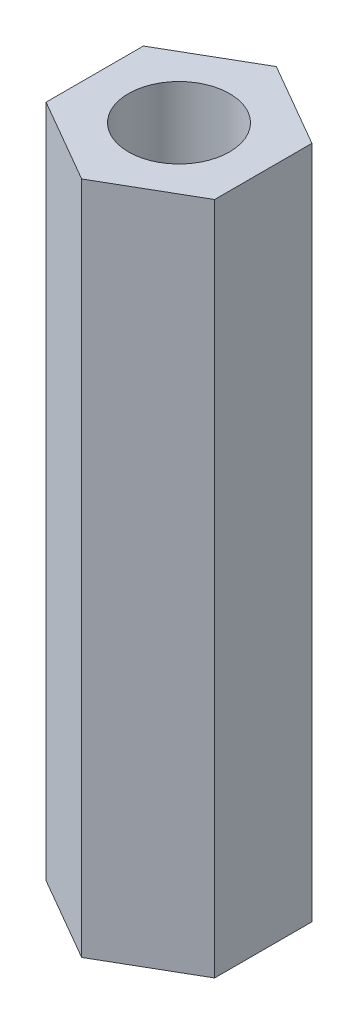
ISO-10303-21;
HEADER;
FILE_DESCRIPTION(('STEP AP214'),'2;1');
FILE_NAME('part.step','',(''),(''),'','','');
FILE_SCHEMA(('AUTOMOTIVE_DESIGN { 1 0 10303 214 1 1 1 1 }'));
ENDSEC;
DATA;
#1=APPLICATION_CONTEXT('core data for automotive mechanical design processes');
#2=APPLICATION_PROTOCOL_DEFINITION('international standard','automotive_design',2000,#1);
#3=PRODUCT_CONTEXT('',#1,'mechanical');
#4=PRODUCT('Part','Part','',(#3));
#5=PRODUCT_RELATED_PRODUCT_CATEGORY('part','',(#4));
#6=PRODUCT_DEFINITION_FORMATION('','',#4);
#7=PRODUCT_DEFINITION_CONTEXT('part definition',#1,'design');
#8=PRODUCT_DEFINITION('design','',#6,#7);
#9=PRODUCT_DEFINITION_SHAPE('','',#8);
#10=(LENGTH_UNIT() NAMED_UNIT(*) SI_UNIT(.MILLI.,.METRE.));
#11=(NAMED_UNIT(*) PLANE_ANGLE_UNIT() SI_UNIT($,.RADIAN.));
#12=(NAMED_UNIT(*) SI_UNIT($,.STERADIAN.) SOLID_ANGLE_UNIT());
#13=UNCERTAINTY_MEASURE_WITH_UNIT(LENGTH_MEASURE(1.E-05),#10,'distance_accuracy_value','');
#14=(GEOMETRIC_REPRESENTATION_CONTEXT(3) GLOBAL_UNCERTAINTY_ASSIGNED_CONTEXT((#13)) GLOBAL_UNIT_ASSIGNED_CONTEXT((#10,
#11,#12)) REPRESENTATION_CONTEXT('',''));
#15=CARTESIAN_POINT('',(0.,0.,0.));
#16=DIRECTION('',(0.,0.,1.));
#17=DIRECTION('',(1.,0.,0.));
#18=AXIS2_PLACEMENT_3D('',#15,#16,#17);
#19=CARTESIAN_POINT('',(0.,20.,0.));
#20=DIRECTION('',(0.,1.,0.));
#21=DIRECTION('',(0.,0.,1.));
#22=AXIS2_PLACEMENT_3D('',#19,#20,#21);
#23=PLANE('',#22);
#24=DIRECTION('',(0.866025403784439,0.,0.5));
#25=VECTOR('',#24,1.);
#26=CARTESIAN_POINT('',(-2.5,20.,1.44337567297406));
#27=LINE('',#26,#25);
#28=CARTESIAN_POINT('',(-2.5,20.,1.44337567297406));
#29=VERTEX_POINT('',#28);
#30=CARTESIAN_POINT('',(0.,20.,2.88675134594813));
#31=VERTEX_POINT('',#30);
#32=EDGE_CURVE('E133',#29,#31,#27,.T.);
#33=ORIENTED_EDGE('',*,*,#32,.T.);
#34=DIRECTION('',(0.866025403784438,0.,-0.5));
#35=VECTOR('',#34,1.);
#36=CARTESIAN_POINT('',(0.,20.,2.88675134594813));
#37=LINE('',#36,#35);
#38=CARTESIAN_POINT('',(2.5,20.,1.44337567297406));
#39=VERTEX_POINT('',#38);
#40=EDGE_CURVE('E91',#31,#39,#37,.T.);
#41=ORIENTED_EDGE('',*,*,#40,.T.);
#42=DIRECTION('',(0.,0.,-1.));
#43=VECTOR('',#42,1.);
#44=CARTESIAN_POINT('',(2.5,20.,1.44337567297406));
#45=LINE('',#44,#43);
#46=CARTESIAN_POINT('',(2.5,20.,-1.44337567297406));
#47=VERTEX_POINT('',#46);
#48=EDGE_CURVE('E104',#39,#47,#45,.T.);
#49=ORIENTED_EDGE('',*,*,#48,.T.);
#50=DIRECTION('',(-0.866025403784439,0.,-0.5));
#51=VECTOR('',#50,1.);
#52=CARTESIAN_POINT('',(2.5,20.,-1.44337567297406));
#53=LINE('',#52,#51);
#54=CARTESIAN_POINT('',(0.,20.,-2.88675134594813));
#55=VERTEX_POINT('',#54);
#56=EDGE_CURVE('E98',#47,#55,#53,.T.);
#57=ORIENTED_EDGE('',*,*,#56,.T.);
#58=DIRECTION('',(-0.866025403784439,0.,0.5));
#59=VECTOR('',#58,1.);
#60=CARTESIAN_POINT('',(0.,20.,-2.88675134594813));
#61=LINE('',#60,#59);
#62=CARTESIAN_POINT('',(-2.5,20.,-1.44337567297406));
#63=VERTEX_POINT('',#62);
#64=EDGE_CURVE('E102',#55,#63,#61,.T.);
#65=ORIENTED_EDGE('',*,*,#64,.T.);
#66=DIRECTION('',(0.,0.,1.));
#67=VECTOR('',#66,1.);
#68=CARTESIAN_POINT('',(-2.5,20.,-1.44337567297406));
#69=LINE('',#68,#67);
#70=EDGE_CURVE('E54',#63,#29,#69,.T.);
#71=ORIENTED_EDGE('',*,*,#70,.T.);
#72=EDGE_LOOP('',(#33,#41,#49,#57,#65,#71));
#73=FACE_BOUND('',#72,.T.);
#74=CARTESIAN_POINT('',(0.,20.,0.));
#75=DIRECTION('',(0.,1.,0.));
#76=DIRECTION('',(0.,0.,1.));
#77=AXIS2_PLACEMENT_3D('',#74,#75,#76);
#78=CIRCLE('',#77,1.5);
#79=CARTESIAN_POINT('',(0.,20.,1.5));
#80=VERTEX_POINT('',#79);
#81=EDGE_CURVE('E126',#80,#80,#78,.T.);
#82=ORIENTED_EDGE('',*,*,#81,.F.);
#83=EDGE_LOOP('',(#82));
#84=FACE_BOUND('',#83,.T.);
#85=ADVANCED_FACE('F37',(#73,#84),#23,.T.);
#86=CARTESIAN_POINT('',(0.,0.,0.));
#87=DIRECTION('',(0.,1.,0.));
#88=DIRECTION('',(0.,0.,1.));
#89=AXIS2_PLACEMENT_3D('',#86,#87,#88);
#90=PLANE('',#89);
#91=DIRECTION('',(0.866025403784439,0.,0.5));
#92=VECTOR('',#91,1.);
#93=CARTESIAN_POINT('',(-2.5,0.,1.44337567297406));
#94=LINE('',#93,#92);
#95=CARTESIAN_POINT('',(-2.5,0.,1.44337567297406));
#96=VERTEX_POINT('',#95);
#97=CARTESIAN_POINT('',(0.,0.,2.88675134594813));
#98=VERTEX_POINT('',#97);
#99=EDGE_CURVE('E122',#96,#98,#94,.T.);
#100=ORIENTED_EDGE('',*,*,#99,.F.);
#101=DIRECTION('',(0.,0.,1.));
#102=VECTOR('',#101,1.);
#103=CARTESIAN_POINT('',(-2.5,0.,-1.44337567297406));
#104=LINE('',#103,#102);
#105=CARTESIAN_POINT('',(-2.5,0.,-1.44337567297406));
#106=VERTEX_POINT('',#105);
#107=EDGE_CURVE('E83',#106,#96,#104,.T.);
#108=ORIENTED_EDGE('',*,*,#107,.F.);
#109=DIRECTION('',(-0.866025403784439,0.,0.5));
#110=VECTOR('',#109,1.);
#111=CARTESIAN_POINT('',(0.,0.,-2.88675134594813));
#112=LINE('',#111,#110);
#113=CARTESIAN_POINT('',(0.,0.,-2.88675134594813));
#114=VERTEX_POINT('',#113);
#115=EDGE_CURVE('E77',#114,#106,#112,.T.);
#116=ORIENTED_EDGE('',*,*,#115,.F.);
#117=DIRECTION('',(-0.866025403784439,0.,-0.5));
#118=VECTOR('',#117,1.);
#119=CARTESIAN_POINT('',(2.5,0.,-1.44337567297406));
#120=LINE('',#119,#118);
#121=CARTESIAN_POINT('',(2.5,0.,-1.44337567297406));
#122=VERTEX_POINT('',#121);
#123=EDGE_CURVE('E112',#122,#114,#120,.T.);
#124=ORIENTED_EDGE('',*,*,#123,.F.);
#125=DIRECTION('',(0.,0.,-1.));
#126=VECTOR('',#125,1.);
#127=CARTESIAN_POINT('',(2.5,0.,1.44337567297406));
#128=LINE('',#127,#126);
#129=CARTESIAN_POINT('',(2.5,0.,1.44337567297406));
#130=VERTEX_POINT('',#129);
#131=EDGE_CURVE('E128',#130,#122,#128,.T.);
#132=ORIENTED_EDGE('',*,*,#131,.F.);
#133=DIRECTION('',(0.866025403784438,0.,-0.5));
#134=VECTOR('',#133,1.);
#135=CARTESIAN_POINT('',(0.,0.,2.88675134594813));
#136=LINE('',#135,#134);
#137=EDGE_CURVE('E125',#98,#130,#136,.T.);
#138=ORIENTED_EDGE('',*,*,#137,.F.);
#139=EDGE_LOOP('',(#100,#108,#116,#124,#132,#138));
#140=FACE_BOUND('',#139,.T.);
#141=CARTESIAN_POINT('',(0.,0.,0.));
#142=DIRECTION('',(0.,1.,0.));
#143=DIRECTION('',(0.,0.,1.));
#144=AXIS2_PLACEMENT_3D('',#141,#142,#143);
#145=CIRCLE('',#144,1.5);
#146=CARTESIAN_POINT('',(0.,0.,1.5));
#147=VERTEX_POINT('',#146);
#148=EDGE_CURVE('E244',#147,#147,#145,.T.);
#149=ORIENTED_EDGE('',*,*,#148,.T.);
#150=EDGE_LOOP('',(#149));
#151=FACE_BOUND('',#150,.T.);
#152=ADVANCED_FACE('F142',(#140,#151),#90,.F.);
#153=CARTESIAN_POINT('',(-2.5,20.,1.44337567297406));
#154=DIRECTION('',(0.5,0.,-0.866025403784438));
#155=DIRECTION('',(-0.866025403784439,0.,-0.5));
#156=AXIS2_PLACEMENT_3D('',#153,#154,#155);
#157=PLANE('',#156);
#158=ORIENTED_EDGE('',*,*,#99,.T.);
#159=DIRECTION('',(0.,-1.,0.));
#160=VECTOR('',#159,1.);
#161=CARTESIAN_POINT('',(0.,20.,2.88675134594813));
#162=LINE('',#161,#160);
#163=EDGE_CURVE('E11',#31,#98,#162,.T.);
#164=ORIENTED_EDGE('',*,*,#163,.F.);
#165=ORIENTED_EDGE('',*,*,#32,.F.);
#166=DIRECTION('',(0.,-1.,0.));
#167=VECTOR('',#166,1.);
#168=CARTESIAN_POINT('',(-2.5,20.,1.44337567297406));
#169=LINE('',#168,#167);
#170=EDGE_CURVE('E118',#29,#96,#169,.T.);
#171=ORIENTED_EDGE('',*,*,#170,.T.);
#172=EDGE_LOOP('',(#158,#164,#165,#171));
#173=FACE_BOUND('',#172,.T.);
#174=ADVANCED_FACE('F39',(#173),#157,.F.);
#175=CARTESIAN_POINT('',(0.,20.,2.88675134594813));
#176=DIRECTION('',(-0.5,0.,-0.866025403784438));
#177=DIRECTION('',(-0.866025403784438,0.,0.5));
#178=AXIS2_PLACEMENT_3D('',#175,#176,#177);
#179=PLANE('',#178);
#180=ORIENTED_EDGE('',*,*,#137,.T.);
#181=DIRECTION('',(0.,-1.,0.));
#182=VECTOR('',#181,1.);
#183=CARTESIAN_POINT('',(2.5,20.,1.44337567297406));
#184=LINE('',#183,#182);
#185=EDGE_CURVE('E46',#39,#130,#184,.T.);
#186=ORIENTED_EDGE('',*,*,#185,.F.);
#187=ORIENTED_EDGE('',*,*,#40,.F.);
#188=ORIENTED_EDGE('',*,*,#163,.T.);
#189=EDGE_LOOP('',(#180,#186,#187,#188));
#190=FACE_BOUND('',#189,.T.);
#191=ADVANCED_FACE('F167',(#190),#179,.F.);
#192=CARTESIAN_POINT('',(2.5,20.,1.44337567297406));
#193=DIRECTION('',(-1.,0.,0.));
#194=DIRECTION('',(0.,0.,1.));
#195=AXIS2_PLACEMENT_3D('',#192,#193,#194);
#196=PLANE('',#195);
#197=ORIENTED_EDGE('',*,*,#131,.T.);
#198=DIRECTION('',(0.,-1.,0.));
#199=VECTOR('',#198,1.);
#200=CARTESIAN_POINT('',(2.5,20.,-1.44337567297406));
#201=LINE('',#200,#199);
#202=EDGE_CURVE('E113',#47,#122,#201,.T.);
#203=ORIENTED_EDGE('',*,*,#202,.F.);
#204=ORIENTED_EDGE('',*,*,#48,.F.);
#205=ORIENTED_EDGE('',*,*,#185,.T.);
#206=EDGE_LOOP('',(#197,#203,#204,#205));
#207=FACE_BOUND('',#206,.T.);
#208=ADVANCED_FACE('F139',(#207),#196,.F.);
#209=CARTESIAN_POINT('',(2.5,20.,-1.44337567297406));
#210=DIRECTION('',(-0.5,0.,0.866025403784439));
#211=DIRECTION('',(0.866025403784439,0.,0.5));
#212=AXIS2_PLACEMENT_3D('',#209,#210,#211);
#213=PLANE('',#212);
#214=ORIENTED_EDGE('',*,*,#123,.T.);
#215=DIRECTION('',(0.,-1.,0.));
#216=VECTOR('',#215,1.);
#217=CARTESIAN_POINT('',(0.,20.,-2.88675134594813));
#218=LINE('',#217,#216);
#219=EDGE_CURVE('E109',#55,#114,#218,.T.);
#220=ORIENTED_EDGE('',*,*,#219,.F.);
#221=ORIENTED_EDGE('',*,*,#56,.F.);
#222=ORIENTED_EDGE('',*,*,#202,.T.);
#223=EDGE_LOOP('',(#214,#220,#221,#222));
#224=FACE_BOUND('',#223,.T.);
#225=ADVANCED_FACE('F110',(#224),#213,.F.);
#226=CARTESIAN_POINT('',(0.,20.,-2.88675134594813));
#227=DIRECTION('',(0.5,0.,0.866025403784439));
#228=DIRECTION('',(0.866025403784439,0.,-0.5));
#229=AXIS2_PLACEMENT_3D('',#226,#227,#228);
#230=PLANE('',#229);
#231=ORIENTED_EDGE('',*,*,#115,.T.);
#232=DIRECTION('',(0.,-1.,0.));
#233=VECTOR('',#232,1.);
#234=CARTESIAN_POINT('',(-2.5,20.,-1.44337567297406));
#235=LINE('',#234,#233);
#236=EDGE_CURVE('E114',#63,#106,#235,.T.);
#237=ORIENTED_EDGE('',*,*,#236,.F.);
#238=ORIENTED_EDGE('',*,*,#64,.F.);
#239=ORIENTED_EDGE('',*,*,#219,.T.);
#240=EDGE_LOOP('',(#231,#237,#238,#239));
#241=FACE_BOUND('',#240,.T.);
#242=ADVANCED_FACE('F116',(#241),#230,.F.);
#243=CARTESIAN_POINT('',(-2.5,20.,-1.44337567297406));
#244=DIRECTION('',(1.,0.,0.));
#245=DIRECTION('',(0.,0.,-1.));
#246=AXIS2_PLACEMENT_3D('',#243,#244,#245);
#247=PLANE('',#246);
#248=ORIENTED_EDGE('',*,*,#107,.T.);
#249=ORIENTED_EDGE('',*,*,#170,.F.);
#250=ORIENTED_EDGE('',*,*,#70,.F.);
#251=ORIENTED_EDGE('',*,*,#236,.T.);
#252=EDGE_LOOP('',(#248,#249,#250,#251));
#253=FACE_BOUND('',#252,.T.);
#254=ADVANCED_FACE('F147',(#253),#247,.F.);
#255=CARTESIAN_POINT('',(0.,20.,0.));
#256=DIRECTION('',(0.,-1.,0.));
#257=DIRECTION('',(0.,0.,-1.));
#258=AXIS2_PLACEMENT_3D('',#255,#256,#257);
#259=CYLINDRICAL_SURFACE('',#258,1.5);
#260=ORIENTED_EDGE('',*,*,#81,.T.);
#261=EDGE_LOOP('',(#260));
#262=FACE_BOUND('',#261,.T.);
#263=ORIENTED_EDGE('',*,*,#148,.F.);
#264=EDGE_LOOP('',(#263));
#265=FACE_BOUND('',#264,.T.);
#266=ADVANCED_FACE('F149',(#262,#265),#259,.F.);
#267=CLOSED_SHELL('',(#85,#152,#174,#191,#208,#225,#242,#254,#266));
#268=MANIFOLD_SOLID_BREP('B2',#267);
#269=ADVANCED_BREP_SHAPE_REPRESENTATION('',(#18,#268),#14);
#270=SHAPE_DEFINITION_REPRESENTATION(#9,#269);
ENDSEC;
END-ISO-10303-21;
